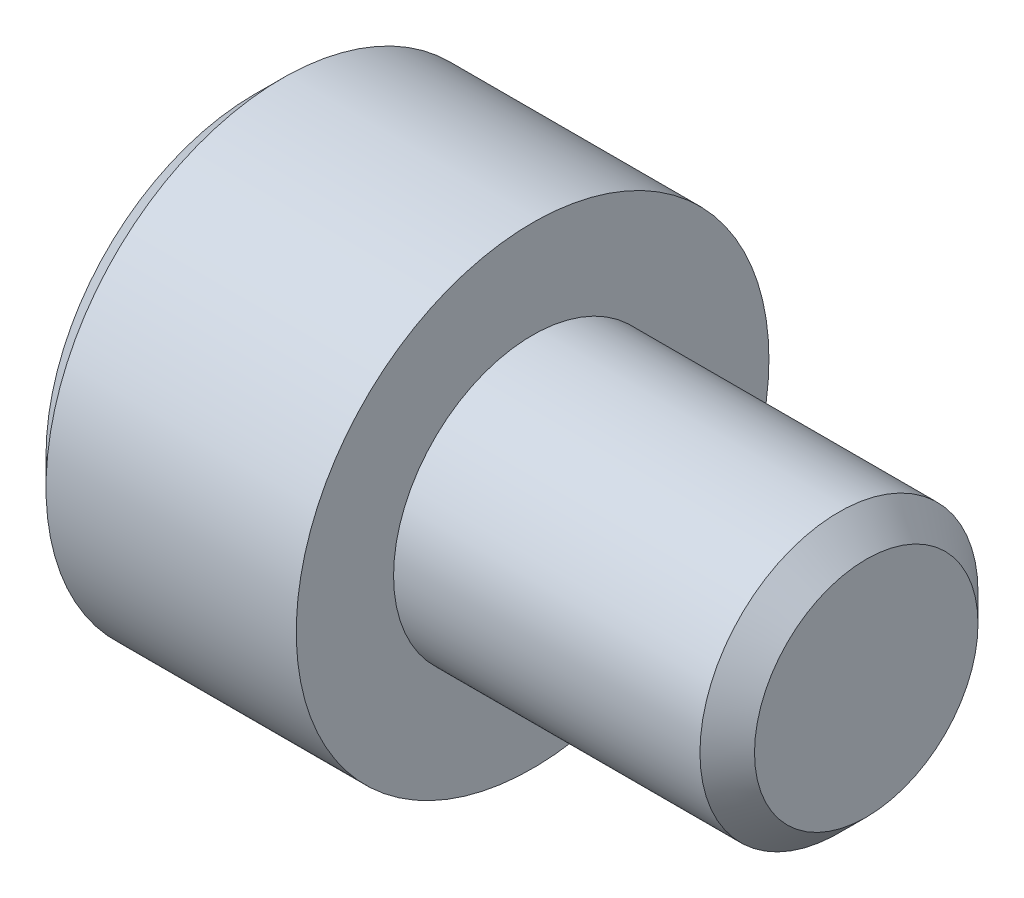
ISO-10303-21;
HEADER;
FILE_DESCRIPTION(('STEP AP214'),'2;1');
FILE_NAME('part.step','',(''),(''),'','','');
FILE_SCHEMA(('AUTOMOTIVE_DESIGN { 1 0 10303 214 1 1 1 1 }'));
ENDSEC;
DATA;
#1=APPLICATION_CONTEXT('core data for automotive mechanical design processes');
#2=APPLICATION_PROTOCOL_DEFINITION('international standard','automotive_design',2000,#1);
#3=PRODUCT_CONTEXT('',#1,'mechanical');
#4=PRODUCT('Part','Part','',(#3));
#5=PRODUCT_RELATED_PRODUCT_CATEGORY('part','',(#4));
#6=PRODUCT_DEFINITION_FORMATION('','',#4);
#7=PRODUCT_DEFINITION_CONTEXT('part definition',#1,'design');
#8=PRODUCT_DEFINITION('design','',#6,#7);
#9=PRODUCT_DEFINITION_SHAPE('','',#8);
#10=(LENGTH_UNIT() NAMED_UNIT(*) SI_UNIT(.MILLI.,.METRE.));
#11=(NAMED_UNIT(*) PLANE_ANGLE_UNIT() SI_UNIT($,.RADIAN.));
#12=(NAMED_UNIT(*) SI_UNIT($,.STERADIAN.) SOLID_ANGLE_UNIT());
#13=UNCERTAINTY_MEASURE_WITH_UNIT(LENGTH_MEASURE(1.E-05),#10,'distance_accuracy_value','');
#14=(GEOMETRIC_REPRESENTATION_CONTEXT(3) GLOBAL_UNCERTAINTY_ASSIGNED_CONTEXT((#13)) GLOBAL_UNIT_ASSIGNED_CONTEXT((#10,
#11,#12)) REPRESENTATION_CONTEXT('',''));
#15=CARTESIAN_POINT('',(0.,0.,0.));
#16=DIRECTION('',(0.,0.,1.));
#17=DIRECTION('',(1.,0.,0.));
#18=AXIS2_PLACEMENT_3D('',#15,#16,#17);
#19=CARTESIAN_POINT('',(-2.5,0.,0.));
#20=DIRECTION('',(1.,0.,0.));
#21=DIRECTION('',(0.,0.,-1.));
#22=AXIS2_PLACEMENT_3D('',#19,#20,#21);
#23=PLANE('',#22);
#24=DIRECTION('',(0.,1.,0.));
#25=VECTOR('',#24,1.);
#26=CARTESIAN_POINT('',(-2.5,0.,-2.));
#27=LINE('',#26,#25);
#28=CARTESIAN_POINT('',(-2.5,-1.15470053837925,-2.));
#29=VERTEX_POINT('',#28);
#30=CARTESIAN_POINT('',(-2.49999999999886,0.,-2.00000000000477));
#31=VERTEX_POINT('',#30);
#32=EDGE_CURVE('E89',#29,#31,#27,.T.);
#33=ORIENTED_EDGE('',*,*,#32,.F.);
#34=DIRECTION('',(0.,0.500000000000003,-0.866025403784437));
#35=VECTOR('',#34,1.);
#36=CARTESIAN_POINT('',(-2.5,-1.73205080756888,-1.));
#37=LINE('',#36,#35);
#38=CARTESIAN_POINT('',(-2.49999999999886,-1.73205080757301,-1.00000000000239));
#39=VERTEX_POINT('',#38);
#40=EDGE_CURVE('E111',#39,#29,#37,.T.);
#41=ORIENTED_EDGE('',*,*,#40,.F.);
#42=CARTESIAN_POINT('',(-2.49999999999773,0.,0.));
#43=DIRECTION('',(-1.,0.,0.));
#44=DIRECTION('',(0.,0.,1.));
#45=AXIS2_PLACEMENT_3D('',#42,#43,#44);
#46=CIRCLE('',#45,2.00000000000955);
#47=EDGE_CURVE('E20',#39,#31,#46,.F.);
#48=ORIENTED_EDGE('',*,*,#47,.T.);
#49=EDGE_LOOP('',(#33,#41,#48));
#50=FACE_BOUND('',#49,.T.);
#51=ADVANCED_FACE('F17',(#50),#23,.F.);
#52=CARTESIAN_POINT('',(-2.5,0.,0.));
#53=DIRECTION('',(1.,0.,0.));
#54=DIRECTION('',(0.,0.,-1.));
#55=AXIS2_PLACEMENT_3D('',#52,#53,#54);
#56=PLANE('',#55);
#57=DIRECTION('',(0.,0.500000000000003,0.866025403784437));
#58=VECTOR('',#57,1.);
#59=CARTESIAN_POINT('',(-2.5,1.15470053837925,-2.));
#60=LINE('',#59,#58);
#61=CARTESIAN_POINT('',(-2.5,1.15470053837925,-2.));
#62=VERTEX_POINT('',#61);
#63=CARTESIAN_POINT('',(-2.49999999999886,1.73205080757301,-1.00000000000239));
#64=VERTEX_POINT('',#63);
#65=EDGE_CURVE('E133',#62,#64,#60,.T.);
#66=ORIENTED_EDGE('',*,*,#65,.F.);
#67=DIRECTION('',(0.,1.,0.));
#68=VECTOR('',#67,1.);
#69=CARTESIAN_POINT('',(-2.5,0.,-2.));
#70=LINE('',#69,#68);
#71=EDGE_CURVE('E140',#31,#62,#70,.T.);
#72=ORIENTED_EDGE('',*,*,#71,.F.);
#73=CARTESIAN_POINT('',(-2.49999999999773,0.,0.));
#74=DIRECTION('',(-1.,0.,0.));
#75=DIRECTION('',(0.,0.,1.));
#76=AXIS2_PLACEMENT_3D('',#73,#74,#75);
#77=CIRCLE('',#76,2.00000000000955);
#78=EDGE_CURVE('E123',#31,#64,#77,.F.);
#79=ORIENTED_EDGE('',*,*,#78,.T.);
#80=EDGE_LOOP('',(#66,#72,#79));
#81=FACE_BOUND('',#80,.T.);
#82=ADVANCED_FACE('F275',(#81),#56,.F.);
#83=CARTESIAN_POINT('',(-2.5,0.,0.));
#84=DIRECTION('',(1.,0.,0.));
#85=DIRECTION('',(0.,0.,-1.));
#86=AXIS2_PLACEMENT_3D('',#83,#84,#85);
#87=PLANE('',#86);
#88=DIRECTION('',(0.,1.,0.));
#89=VECTOR('',#88,1.);
#90=CARTESIAN_POINT('',(-2.5,0.,2.));
#91=LINE('',#90,#89);
#92=CARTESIAN_POINT('',(-2.5,1.15470053837925,2.));
#93=VERTEX_POINT('',#92);
#94=CARTESIAN_POINT('',(-2.49999999999886,0.,2.00000000000477));
#95=VERTEX_POINT('',#94);
#96=EDGE_CURVE('E124',#93,#95,#91,.F.);
#97=ORIENTED_EDGE('',*,*,#96,.F.);
#98=DIRECTION('',(0.,-0.500000000000003,0.866025403784437));
#99=VECTOR('',#98,1.);
#100=CARTESIAN_POINT('',(-2.5,1.73205080756888,1.));
#101=LINE('',#100,#99);
#102=CARTESIAN_POINT('',(-2.49999999999886,1.73205080757301,1.00000000000239));
#103=VERTEX_POINT('',#102);
#104=EDGE_CURVE('E126',#103,#93,#101,.T.);
#105=ORIENTED_EDGE('',*,*,#104,.F.);
#106=CARTESIAN_POINT('',(-2.49999999999773,0.,0.));
#107=DIRECTION('',(-1.,0.,0.));
#108=DIRECTION('',(0.,0.,1.));
#109=AXIS2_PLACEMENT_3D('',#106,#107,#108);
#110=CIRCLE('',#109,2.00000000000955);
#111=EDGE_CURVE('E105',#103,#95,#110,.F.);
#112=ORIENTED_EDGE('',*,*,#111,.T.);
#113=EDGE_LOOP('',(#97,#105,#112));
#114=FACE_BOUND('',#113,.T.);
#115=ADVANCED_FACE('F177',(#114),#87,.F.);
#116=CARTESIAN_POINT('',(-2.49999999999773,0.,0.));
#117=DIRECTION('',(-1.,0.,0.));
#118=DIRECTION('',(0.,0.,1.));
#119=AXIS2_PLACEMENT_3D('',#116,#117,#118);
#120=CONICAL_SURFACE('',#119,2.00000000000955,1.30899693893931);
#121=CARTESIAN_POINT('',(-2.49999999999773,0.,0.));
#122=DIRECTION('',(-1.,0.,0.));
#123=DIRECTION('',(0.,0.,1.));
#124=AXIS2_PLACEMENT_3D('',#121,#122,#123);
#125=CIRCLE('',#124,2.00000000000955);
#126=EDGE_CURVE('E125',#64,#103,#125,.F.);
#127=ORIENTED_EDGE('',*,*,#126,.F.);
#128=ORIENTED_EDGE('',*,*,#78,.F.);
#129=ORIENTED_EDGE('',*,*,#47,.F.);
#130=CARTESIAN_POINT('',(-2.49999999999773,0.,0.));
#131=DIRECTION('',(-1.,0.,0.));
#132=DIRECTION('',(0.,0.,1.));
#133=AXIS2_PLACEMENT_3D('',#130,#131,#132);
#134=CIRCLE('',#133,2.00000000000955);
#135=CARTESIAN_POINT('',(-2.49999999999886,-1.73205080757301,1.00000000000239));
#136=VERTEX_POINT('',#135);
#137=EDGE_CURVE('E94',#136,#39,#134,.F.);
#138=ORIENTED_EDGE('',*,*,#137,.F.);
#139=CARTESIAN_POINT('',(-2.49999999999773,0.,0.));
#140=DIRECTION('',(-1.,0.,0.));
#141=DIRECTION('',(0.,0.,1.));
#142=AXIS2_PLACEMENT_3D('',#139,#140,#141);
#143=CIRCLE('',#142,2.00000000000955);
#144=EDGE_CURVE('E104',#136,#95,#143,.T.);
#145=ORIENTED_EDGE('',*,*,#144,.T.);
#146=ORIENTED_EDGE('',*,*,#111,.F.);
#147=EDGE_LOOP('',(#127,#128,#129,#138,#145,#146));
#148=FACE_BOUND('',#147,.T.);
#149=CARTESIAN_POINT('',(-1.96410161511551,5.11590769747272E-10,0.));
#150=VERTEX_POINT('',#149);
#151=VERTEX_LOOP('',#150);
#152=FACE_BOUND('',#151,.T.);
#153=ADVANCED_FACE('F120',(#148,#152),#120,.F.);
#154=CARTESIAN_POINT('',(6.,1.00475,0.));
#155=DIRECTION('',(1.,0.,0.));
#156=DIRECTION('',(0.,0.,-1.));
#157=AXIS2_PLACEMENT_3D('',#154,#155,#156);
#158=PLANE('',#157);
#159=CARTESIAN_POINT('',(6.00000000002865,0.,0.));
#160=DIRECTION('',(-1.,0.,0.));
#161=DIRECTION('',(0.,0.,1.));
#162=AXIS2_PLACEMENT_3D('',#159,#160,#161);
#163=CIRCLE('',#162,2.00949999998556);
#164=CARTESIAN_POINT('',(6.00000000002865,0.,2.00949999998556));
#165=VERTEX_POINT('',#164);
#166=EDGE_CURVE('E160',#165,#165,#163,.T.);
#167=ORIENTED_EDGE('',*,*,#166,.F.);
#168=EDGE_LOOP('',(#167));
#169=FACE_BOUND('',#168,.T.);
#170=ADVANCED_FACE('F263',(#169),#158,.T.);
#171=CARTESIAN_POINT('',(-2.5,0.,0.));
#172=DIRECTION('',(1.,0.,0.));
#173=DIRECTION('',(0.,0.,-1.));
#174=AXIS2_PLACEMENT_3D('',#171,#172,#173);
#175=PLANE('',#174);
#176=DIRECTION('',(0.,-0.5,-0.866025403784439));
#177=VECTOR('',#176,1.);
#178=CARTESIAN_POINT('',(-2.5,-2.3094010767585,0.));
#179=LINE('',#178,#177);
#180=CARTESIAN_POINT('',(-2.5,-1.15470053837925,2.));
#181=VERTEX_POINT('',#180);
#182=EDGE_CURVE('E182',#136,#181,#179,.F.);
#183=ORIENTED_EDGE('',*,*,#182,.T.);
#184=DIRECTION('',(0.,1.,0.));
#185=VECTOR('',#184,1.);
#186=CARTESIAN_POINT('',(-2.5,-1.15470053837925,2.));
#187=LINE('',#186,#185);
#188=EDGE_CURVE('E163',#181,#95,#187,.T.);
#189=ORIENTED_EDGE('',*,*,#188,.T.);
#190=ORIENTED_EDGE('',*,*,#144,.F.);
#191=EDGE_LOOP('',(#183,#189,#190));
#192=FACE_BOUND('',#191,.T.);
#193=ADVANCED_FACE('F181',(#192),#175,.F.);
#194=CARTESIAN_POINT('',(-2.5,0.,0.));
#195=DIRECTION('',(1.,0.,0.));
#196=DIRECTION('',(0.,0.,-1.));
#197=AXIS2_PLACEMENT_3D('',#194,#195,#196);
#198=PLANE('',#197);
#199=DIRECTION('',(0.,0.5,-0.866025403784439));
#200=VECTOR('',#199,1.);
#201=CARTESIAN_POINT('',(-2.5,-1.15470053837925,-2.));
#202=LINE('',#201,#200);
#203=CARTESIAN_POINT('',(-2.5,-2.3094010767585,0.));
#204=VERTEX_POINT('',#203);
#205=EDGE_CURVE('E97',#39,#204,#202,.F.);
#206=ORIENTED_EDGE('',*,*,#205,.T.);
#207=DIRECTION('',(0.,-0.5,-0.866025403784439));
#208=VECTOR('',#207,1.);
#209=CARTESIAN_POINT('',(-2.5,-2.3094010767585,0.));
#210=LINE('',#209,#208);
#211=EDGE_CURVE('E99',#204,#136,#210,.F.);
#212=ORIENTED_EDGE('',*,*,#211,.T.);
#213=ORIENTED_EDGE('',*,*,#137,.T.);
#214=EDGE_LOOP('',(#206,#212,#213));
#215=FACE_BOUND('',#214,.T.);
#216=ADVANCED_FACE('F96',(#215),#198,.F.);
#217=CARTESIAN_POINT('',(-2.5,0.,0.));
#218=DIRECTION('',(1.,0.,0.));
#219=DIRECTION('',(0.,0.,-1.));
#220=AXIS2_PLACEMENT_3D('',#217,#218,#219);
#221=PLANE('',#220);
#222=DIRECTION('',(0.,-0.5,0.866025403784439));
#223=VECTOR('',#222,1.);
#224=CARTESIAN_POINT('',(-2.5,1.15470053837925,2.));
#225=LINE('',#224,#223);
#226=CARTESIAN_POINT('',(-2.5,2.3094010767585,0.));
#227=VERTEX_POINT('',#226);
#228=EDGE_CURVE('E145',#103,#227,#225,.F.);
#229=ORIENTED_EDGE('',*,*,#228,.T.);
#230=DIRECTION('',(0.,0.5,0.866025403784439));
#231=VECTOR('',#230,1.);
#232=CARTESIAN_POINT('',(-2.5,2.3094010767585,0.));
#233=LINE('',#232,#231);
#234=EDGE_CURVE('E148',#227,#64,#233,.F.);
#235=ORIENTED_EDGE('',*,*,#234,.T.);
#236=ORIENTED_EDGE('',*,*,#126,.T.);
#237=EDGE_LOOP('',(#229,#235,#236));
#238=FACE_BOUND('',#237,.T.);
#239=ADVANCED_FACE('F169',(#238),#221,.F.);
#240=CARTESIAN_POINT('',(5.50950000007333,0.,0.));
#241=DIRECTION('',(-1.,0.,0.));
#242=DIRECTION('',(0.,0.,1.));
#243=AXIS2_PLACEMENT_3D('',#240,#241,#242);
#244=CONICAL_SURFACE('',#243,2.49999999999773,0.785398163455393);
#245=CARTESIAN_POINT('',(5.5095,0.,0.));
#246=DIRECTION('',(1.,0.,0.));
#247=DIRECTION('',(0.,0.,-1.));
#248=AXIS2_PLACEMENT_3D('',#245,#246,#247);
#249=CIRCLE('',#248,2.5);
#250=CARTESIAN_POINT('',(5.5095,0.,-2.5));
#251=VERTEX_POINT('',#250);
#252=EDGE_CURVE('E189',#251,#251,#249,.F.);
#253=ORIENTED_EDGE('',*,*,#252,.F.);
#254=EDGE_LOOP('',(#253));
#255=FACE_BOUND('',#254,.T.);
#256=ORIENTED_EDGE('',*,*,#166,.T.);
#257=EDGE_LOOP('',(#256));
#258=FACE_BOUND('',#257,.T.);
#259=ADVANCED_FACE('F257',(#255,#258),#244,.T.);
#260=CARTESIAN_POINT('',(-5.,-1.15470053837925,2.));
#261=DIRECTION('',(0.,0.,1.));
#262=DIRECTION('',(1.,0.,0.));
#263=AXIS2_PLACEMENT_3D('',#260,#261,#262);
#264=PLANE('',#263);
#265=DIRECTION('',(1.,0.,0.));
#266=VECTOR('',#265,1.);
#267=CARTESIAN_POINT('',(-5.,1.15470053837925,2.));
#268=LINE('',#267,#266);
#269=CARTESIAN_POINT('',(-5.,1.15470053837925,2.));
#270=VERTEX_POINT('',#269);
#271=EDGE_CURVE('E143',#270,#93,#268,.T.);
#272=ORIENTED_EDGE('',*,*,#271,.T.);
#273=ORIENTED_EDGE('',*,*,#96,.T.);
#274=ORIENTED_EDGE('',*,*,#188,.F.);
#275=DIRECTION('',(1.,0.,0.));
#276=VECTOR('',#275,1.);
#277=CARTESIAN_POINT('',(-5.,-1.15470053837925,2.));
#278=LINE('',#277,#276);
#279=CARTESIAN_POINT('',(-5.,-1.15470053837925,2.));
#280=VERTEX_POINT('',#279);
#281=EDGE_CURVE('E114',#181,#280,#278,.F.);
#282=ORIENTED_EDGE('',*,*,#281,.T.);
#283=DIRECTION('',(0.,1.,0.));
#284=VECTOR('',#283,1.);
#285=CARTESIAN_POINT('',(-5.,1.875,2.));
#286=LINE('',#285,#284);
#287=EDGE_CURVE('E193',#270,#280,#286,.F.);
#288=ORIENTED_EDGE('',*,*,#287,.F.);
#289=EDGE_LOOP('',(#272,#273,#274,#282,#288));
#290=FACE_BOUND('',#289,.T.);
#291=ADVANCED_FACE('F211',(#290),#264,.F.);
#292=CARTESIAN_POINT('',(-5.,-2.3094010767585,0.));
#293=DIRECTION('',(0.,-0.866025403784439,0.5));
#294=DIRECTION('',(0.,-0.5,-0.866025403784439));
#295=AXIS2_PLACEMENT_3D('',#292,#293,#294);
#296=PLANE('',#295);
#297=ORIENTED_EDGE('',*,*,#281,.F.);
#298=ORIENTED_EDGE('',*,*,#182,.F.);
#299=ORIENTED_EDGE('',*,*,#211,.F.);
#300=DIRECTION('',(1.,0.,0.));
#301=VECTOR('',#300,1.);
#302=CARTESIAN_POINT('',(-5.,-2.3094010767585,0.));
#303=LINE('',#302,#301);
#304=CARTESIAN_POINT('',(-5.,-2.3094010767585,0.));
#305=VERTEX_POINT('',#304);
#306=EDGE_CURVE('E113',#204,#305,#303,.F.);
#307=ORIENTED_EDGE('',*,*,#306,.T.);
#308=DIRECTION('',(0.,-0.499999999999999,-0.866025403784439));
#309=VECTOR('',#308,1.);
#310=CARTESIAN_POINT('',(-5.,-1.15470053837925,2.));
#311=LINE('',#310,#309);
#312=EDGE_CURVE('E196',#280,#305,#311,.T.);
#313=ORIENTED_EDGE('',*,*,#312,.F.);
#314=EDGE_LOOP('',(#297,#298,#299,#307,#313));
#315=FACE_BOUND('',#314,.T.);
#316=ADVANCED_FACE('F214',(#315),#296,.F.);
#317=CARTESIAN_POINT('',(-5.,-1.15470053837925,-2.));
#318=DIRECTION('',(0.,-0.866025403784439,-0.5));
#319=DIRECTION('',(0.,0.5,-0.866025403784439));
#320=AXIS2_PLACEMENT_3D('',#317,#318,#319);
#321=PLANE('',#320);
#322=ORIENTED_EDGE('',*,*,#306,.F.);
#323=ORIENTED_EDGE('',*,*,#205,.F.);
#324=ORIENTED_EDGE('',*,*,#40,.T.);
#325=DIRECTION('',(-1.,0.,0.));
#326=VECTOR('',#325,1.);
#327=CARTESIAN_POINT('',(-5.,-1.15470053837925,-2.));
#328=LINE('',#327,#326);
#329=CARTESIAN_POINT('',(-5.,-1.15470053837925,-2.));
#330=VERTEX_POINT('',#329);
#331=EDGE_CURVE('E149',#29,#330,#328,.T.);
#332=ORIENTED_EDGE('',*,*,#331,.T.);
#333=DIRECTION('',(0.,0.499999999999999,-0.866025403784439));
#334=VECTOR('',#333,1.);
#335=CARTESIAN_POINT('',(-5.,-2.3094010767585,0.));
#336=LINE('',#335,#334);
#337=EDGE_CURVE('E199',#305,#330,#336,.T.);
#338=ORIENTED_EDGE('',*,*,#337,.F.);
#339=EDGE_LOOP('',(#322,#323,#324,#332,#338));
#340=FACE_BOUND('',#339,.T.);
#341=ADVANCED_FACE('F110',(#340),#321,.F.);
#342=CARTESIAN_POINT('',(-5.,1.15470053837925,-2.));
#343=DIRECTION('',(0.,0.,-1.));
#344=DIRECTION('',(-1.,0.,0.));
#345=AXIS2_PLACEMENT_3D('',#342,#343,#344);
#346=PLANE('',#345);
#347=ORIENTED_EDGE('',*,*,#331,.F.);
#348=ORIENTED_EDGE('',*,*,#32,.T.);
#349=ORIENTED_EDGE('',*,*,#71,.T.);
#350=DIRECTION('',(1.,0.,0.));
#351=VECTOR('',#350,1.);
#352=CARTESIAN_POINT('',(-5.,1.15470053837925,-2.));
#353=LINE('',#352,#351);
#354=CARTESIAN_POINT('',(-5.,1.15470053837925,-2.));
#355=VERTEX_POINT('',#354);
#356=EDGE_CURVE('E146',#62,#355,#353,.F.);
#357=ORIENTED_EDGE('',*,*,#356,.T.);
#358=DIRECTION('',(0.,1.,0.));
#359=VECTOR('',#358,1.);
#360=CARTESIAN_POINT('',(-5.,1.875,-2.));
#361=LINE('',#360,#359);
#362=EDGE_CURVE('E202',#330,#355,#361,.T.);
#363=ORIENTED_EDGE('',*,*,#362,.F.);
#364=EDGE_LOOP('',(#347,#348,#349,#357,#363));
#365=FACE_BOUND('',#364,.T.);
#366=ADVANCED_FACE('F216',(#365),#346,.F.);
#367=CARTESIAN_POINT('',(-5.,2.3094010767585,0.));
#368=DIRECTION('',(0.,0.866025403784439,-0.5));
#369=DIRECTION('',(0.,0.5,0.866025403784439));
#370=AXIS2_PLACEMENT_3D('',#367,#368,#369);
#371=PLANE('',#370);
#372=ORIENTED_EDGE('',*,*,#356,.F.);
#373=ORIENTED_EDGE('',*,*,#65,.T.);
#374=ORIENTED_EDGE('',*,*,#234,.F.);
#375=DIRECTION('',(1.,0.,0.));
#376=VECTOR('',#375,1.);
#377=CARTESIAN_POINT('',(-5.,2.3094010767585,0.));
#378=LINE('',#377,#376);
#379=CARTESIAN_POINT('',(-5.,2.3094010767585,0.));
#380=VERTEX_POINT('',#379);
#381=EDGE_CURVE('E35',#227,#380,#378,.F.);
#382=ORIENTED_EDGE('',*,*,#381,.T.);
#383=DIRECTION('',(0.,0.499999999999999,0.866025403784439));
#384=VECTOR('',#383,1.);
#385=CARTESIAN_POINT('',(-5.,1.15470053837925,-2.));
#386=LINE('',#385,#384);
#387=EDGE_CURVE('E205',#355,#380,#386,.T.);
#388=ORIENTED_EDGE('',*,*,#387,.F.);
#389=EDGE_LOOP('',(#372,#373,#374,#382,#388));
#390=FACE_BOUND('',#389,.T.);
#391=ADVANCED_FACE('F219',(#390),#371,.F.);
#392=CARTESIAN_POINT('',(-5.,1.15470053837925,2.));
#393=DIRECTION('',(0.,0.866025403784439,0.5));
#394=DIRECTION('',(0.,-0.5,0.866025403784439));
#395=AXIS2_PLACEMENT_3D('',#392,#393,#394);
#396=PLANE('',#395);
#397=ORIENTED_EDGE('',*,*,#381,.F.);
#398=ORIENTED_EDGE('',*,*,#228,.F.);
#399=ORIENTED_EDGE('',*,*,#104,.T.);
#400=ORIENTED_EDGE('',*,*,#271,.F.);
#401=DIRECTION('',(0.,-0.499999999999999,0.866025403784439));
#402=VECTOR('',#401,1.);
#403=CARTESIAN_POINT('',(-5.,2.3094010767585,0.));
#404=LINE('',#403,#402);
#405=EDGE_CURVE('E159',#380,#270,#404,.T.);
#406=ORIENTED_EDGE('',*,*,#405,.F.);
#407=EDGE_LOOP('',(#397,#398,#399,#400,#406));
#408=FACE_BOUND('',#407,.T.);
#409=ADVANCED_FACE('F173',(#408),#396,.F.);
#410=CARTESIAN_POINT('',(2.75475,0.,0.));
#411=DIRECTION('',(1.,0.,0.));
#412=DIRECTION('',(0.,0.,-1.));
#413=AXIS2_PLACEMENT_3D('',#410,#411,#412);
#414=CYLINDRICAL_SURFACE('',#413,2.5);
#415=CARTESIAN_POINT('',(0.,0.,0.));
#416=DIRECTION('',(1.,0.,0.));
#417=DIRECTION('',(0.,0.,-1.));
#418=AXIS2_PLACEMENT_3D('',#415,#416,#417);
#419=CIRCLE('',#418,2.5);
#420=CARTESIAN_POINT('',(0.,0.,-2.5));
#421=VERTEX_POINT('',#420);
#422=EDGE_CURVE('E156',#421,#421,#419,.F.);
#423=ORIENTED_EDGE('',*,*,#422,.F.);
#424=EDGE_LOOP('',(#423));
#425=FACE_BOUND('',#424,.T.);
#426=ORIENTED_EDGE('',*,*,#252,.T.);
#427=EDGE_LOOP('',(#426));
#428=FACE_BOUND('',#427,.T.);
#429=ADVANCED_FACE('F227',(#425,#428),#414,.T.);
#430=CARTESIAN_POINT('',(-5.,1.875,0.));
#431=DIRECTION('',(-1.,0.,0.));
#432=DIRECTION('',(0.,0.,1.));
#433=AXIS2_PLACEMENT_3D('',#430,#431,#432);
#434=PLANE('',#433);
#435=CARTESIAN_POINT('',(-4.99999999999545,0.,0.));
#436=DIRECTION('',(1.,0.,0.));
#437=DIRECTION('',(0.,0.,-1.));
#438=AXIS2_PLACEMENT_3D('',#435,#436,#437);
#439=CIRCLE('',#438,3.75000000002501);
#440=CARTESIAN_POINT('',(-4.99999999999545,0.,-3.75000000002501));
#441=VERTEX_POINT('',#440);
#442=EDGE_CURVE('E153',#441,#441,#439,.T.);
#443=ORIENTED_EDGE('',*,*,#442,.F.);
#444=EDGE_LOOP('',(#443));
#445=FACE_BOUND('',#444,.T.);
#446=ORIENTED_EDGE('',*,*,#387,.T.);
#447=ORIENTED_EDGE('',*,*,#405,.T.);
#448=ORIENTED_EDGE('',*,*,#287,.T.);
#449=ORIENTED_EDGE('',*,*,#312,.T.);
#450=ORIENTED_EDGE('',*,*,#337,.T.);
#451=ORIENTED_EDGE('',*,*,#362,.T.);
#452=EDGE_LOOP('',(#446,#447,#448,#449,#450,#451));
#453=FACE_BOUND('',#452,.T.);
#454=ADVANCED_FACE('F210',(#445,#453),#434,.T.);
#455=CARTESIAN_POINT('',(0.,3.375,0.));
#456=DIRECTION('',(1.,0.,0.));
#457=DIRECTION('',(0.,0.,-1.));
#458=AXIS2_PLACEMENT_3D('',#455,#456,#457);
#459=PLANE('',#458);
#460=ORIENTED_EDGE('',*,*,#422,.T.);
#461=EDGE_LOOP('',(#460));
#462=FACE_BOUND('',#461,.T.);
#463=CARTESIAN_POINT('',(0.,0.,0.));
#464=DIRECTION('',(1.,0.,0.));
#465=DIRECTION('',(0.,0.,-1.));
#466=AXIS2_PLACEMENT_3D('',#463,#464,#465);
#467=CIRCLE('',#466,4.25);
#468=CARTESIAN_POINT('',(0.,0.,-4.25));
#469=VERTEX_POINT('',#468);
#470=EDGE_CURVE('E26',#469,#469,#467,.F.);
#471=ORIENTED_EDGE('',*,*,#470,.F.);
#472=EDGE_LOOP('',(#471));
#473=FACE_BOUND('',#472,.T.);
#474=ADVANCED_FACE('F238',(#462,#473),#459,.T.);
#475=CARTESIAN_POINT('',(-4.50000000017781,0.,0.));
#476=DIRECTION('',(1.,0.,0.));
#477=DIRECTION('',(0.,0.,-1.));
#478=AXIS2_PLACEMENT_3D('',#475,#476,#477);
#479=CONICAL_SURFACE('',#478,4.24999999984266,0.785398163397448);
#480=ORIENTED_EDGE('',*,*,#442,.T.);
#481=EDGE_LOOP('',(#480));
#482=FACE_BOUND('',#481,.T.);
#483=CARTESIAN_POINT('',(-4.5,0.,0.));
#484=DIRECTION('',(1.,0.,0.));
#485=DIRECTION('',(0.,0.,-1.));
#486=AXIS2_PLACEMENT_3D('',#483,#484,#485);
#487=CIRCLE('',#486,4.25);
#488=CARTESIAN_POINT('',(-4.5,0.,-4.25));
#489=VERTEX_POINT('',#488);
#490=EDGE_CURVE('E11',#489,#489,#487,.T.);
#491=ORIENTED_EDGE('',*,*,#490,.F.);
#492=EDGE_LOOP('',(#491));
#493=FACE_BOUND('',#492,.T.);
#494=ADVANCED_FACE('F232',(#482,#493),#479,.T.);
#495=CARTESIAN_POINT('',(-2.25,0.,0.));
#496=DIRECTION('',(1.,0.,0.));
#497=DIRECTION('',(0.,0.,-1.));
#498=AXIS2_PLACEMENT_3D('',#495,#496,#497);
#499=CYLINDRICAL_SURFACE('',#498,4.25);
#500=ORIENTED_EDGE('',*,*,#470,.T.);
#501=EDGE_LOOP('',(#500));
#502=FACE_BOUND('',#501,.T.);
#503=ORIENTED_EDGE('',*,*,#490,.T.);
#504=EDGE_LOOP('',(#503));
#505=FACE_BOUND('',#504,.T.);
#506=ADVANCED_FACE('F230',(#502,#505),#499,.T.);
#507=CLOSED_SHELL('',(#51,#82,#115,#153,#170,#193,#216,#239,#259,#291,#316,#341,#366,#391,#409,
#429,#454,#474,#494,#506));
#508=MANIFOLD_SOLID_BREP('B1',#507);
#509=ADVANCED_BREP_SHAPE_REPRESENTATION('',(#18,#508),#14);
#510=SHAPE_DEFINITION_REPRESENTATION(#9,#509);
ENDSEC;
END-ISO-10303-21;
